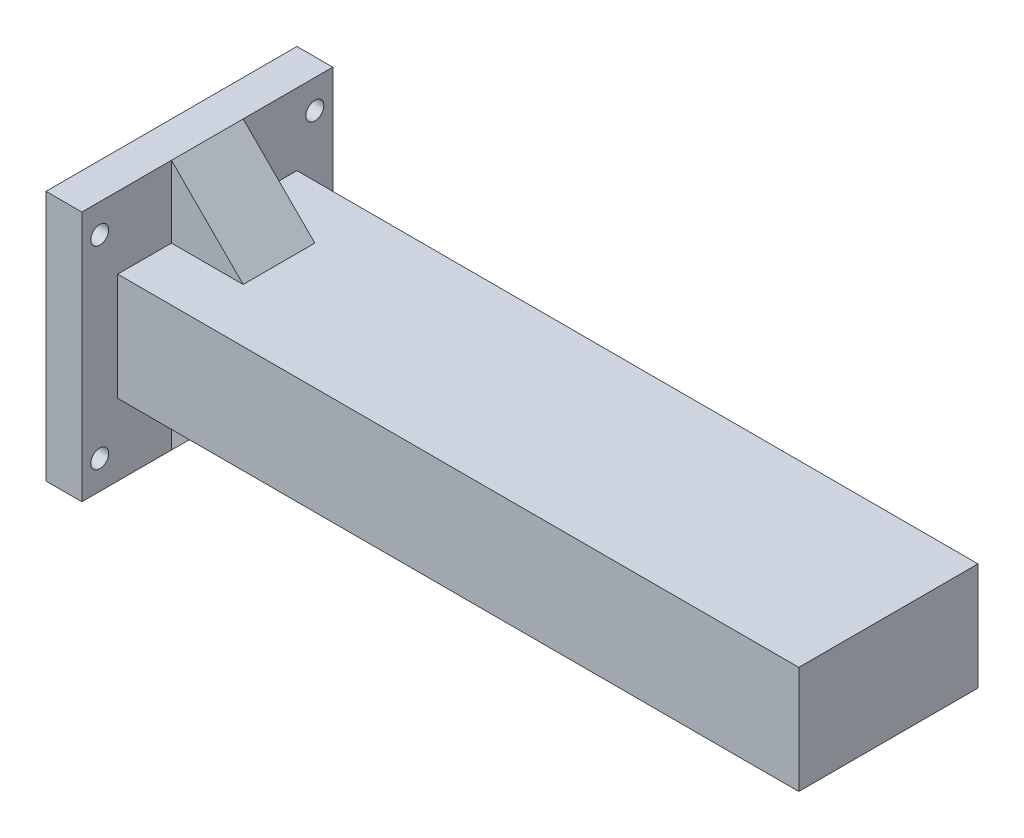
ISO-10303-21;
HEADER;
FILE_DESCRIPTION(('STEP AP214'),'2;1');
FILE_NAME('part.step','',(''),(''),'','','');
FILE_SCHEMA(('AUTOMOTIVE_DESIGN { 1 0 10303 214 1 1 1 1 }'));
ENDSEC;
DATA;
#1=APPLICATION_CONTEXT('core data for automotive mechanical design processes');
#2=APPLICATION_PROTOCOL_DEFINITION('international standard','automotive_design',2000,#1);
#3=PRODUCT_CONTEXT('',#1,'mechanical');
#4=PRODUCT('Part','Part','',(#3));
#5=PRODUCT_RELATED_PRODUCT_CATEGORY('part','',(#4));
#6=PRODUCT_DEFINITION_FORMATION('','',#4);
#7=PRODUCT_DEFINITION_CONTEXT('part definition',#1,'design');
#8=PRODUCT_DEFINITION('design','',#6,#7);
#9=PRODUCT_DEFINITION_SHAPE('','',#8);
#10=(LENGTH_UNIT() NAMED_UNIT(*) SI_UNIT(.MILLI.,.METRE.));
#11=(NAMED_UNIT(*) PLANE_ANGLE_UNIT() SI_UNIT($,.RADIAN.));
#12=(NAMED_UNIT(*) SI_UNIT($,.STERADIAN.) SOLID_ANGLE_UNIT());
#13=UNCERTAINTY_MEASURE_WITH_UNIT(LENGTH_MEASURE(1.E-05),#10,'distance_accuracy_value','');
#14=(GEOMETRIC_REPRESENTATION_CONTEXT(3) GLOBAL_UNCERTAINTY_ASSIGNED_CONTEXT((#13)) GLOBAL_UNIT_ASSIGNED_CONTEXT((#10,
#11,#12)) REPRESENTATION_CONTEXT('',''));
#15=CARTESIAN_POINT('',(0.,0.,0.));
#16=DIRECTION('',(0.,0.,1.));
#17=DIRECTION('',(1.,0.,0.));
#18=AXIS2_PLACEMENT_3D('',#15,#16,#17);
#19=CARTESIAN_POINT('',(-45.,17.5,12.5));
#20=DIRECTION('',(-1.,0.,0.));
#21=DIRECTION('',(0.,0.,1.));
#22=AXIS2_PLACEMENT_3D('',#19,#20,#21);
#23=PLANE('',#22);
#24=CARTESIAN_POINT('',(-45.,13.5,-15.));
#25=DIRECTION('',(-1.,0.,0.));
#26=DIRECTION('',(0.,0.,1.));
#27=AXIS2_PLACEMENT_3D('',#24,#25,#26);
#28=CIRCLE('',#27,1.24999999999998);
#29=CARTESIAN_POINT('',(-45.,13.5,-13.75));
#30=VERTEX_POINT('',#29);
#31=EDGE_CURVE('E196',#30,#30,#28,.T.);
#32=ORIENTED_EDGE('',*,*,#31,.T.);
#33=EDGE_LOOP('',(#32));
#34=FACE_BOUND('',#33,.T.);
#35=CARTESIAN_POINT('',(-45.,-13.5,-15.));
#36=DIRECTION('',(-1.,0.,0.));
#37=DIRECTION('',(0.,0.,1.));
#38=AXIS2_PLACEMENT_3D('',#35,#36,#37);
#39=CIRCLE('',#38,1.24999999999998);
#40=CARTESIAN_POINT('',(-45.,-13.5,-13.75));
#41=VERTEX_POINT('',#40);
#42=EDGE_CURVE('E211',#41,#41,#39,.T.);
#43=ORIENTED_EDGE('',*,*,#42,.T.);
#44=EDGE_LOOP('',(#43));
#45=FACE_BOUND('',#44,.T.);
#46=DIRECTION('',(0.,1.,0.));
#47=VECTOR('',#46,1.);
#48=CARTESIAN_POINT('',(-45.,17.5,-5.));
#49=LINE('',#48,#47);
#50=CARTESIAN_POINT('',(-45.,-17.5,-5.));
#51=VERTEX_POINT('',#50);
#52=CARTESIAN_POINT('',(-45.,-7.5,-5.));
#53=VERTEX_POINT('',#52);
#54=EDGE_CURVE('E141',#51,#53,#49,.T.);
#55=ORIENTED_EDGE('',*,*,#54,.F.);
#56=DIRECTION('',(0.,0.,-1.));
#57=VECTOR('',#56,1.);
#58=CARTESIAN_POINT('',(-45.,-17.5,12.5));
#59=LINE('',#58,#57);
#60=CARTESIAN_POINT('',(-45.,-17.5,-17.5));
#61=VERTEX_POINT('',#60);
#62=EDGE_CURVE('E285',#51,#61,#59,.T.);
#63=ORIENTED_EDGE('',*,*,#62,.T.);
#64=DIRECTION('',(0.,1.,0.));
#65=VECTOR('',#64,1.);
#66=CARTESIAN_POINT('',(-45.,17.5,-17.5));
#67=LINE('',#66,#65);
#68=CARTESIAN_POINT('',(-45.,17.5,-17.5));
#69=VERTEX_POINT('',#68);
#70=EDGE_CURVE('E238',#61,#69,#67,.T.);
#71=ORIENTED_EDGE('',*,*,#70,.T.);
#72=DIRECTION('',(0.,0.,-1.));
#73=VECTOR('',#72,1.);
#74=CARTESIAN_POINT('',(-45.,17.5,12.5));
#75=LINE('',#74,#73);
#76=CARTESIAN_POINT('',(-45.,17.5,-5.));
#77=VERTEX_POINT('',#76);
#78=EDGE_CURVE('E258',#77,#69,#75,.T.);
#79=ORIENTED_EDGE('',*,*,#78,.F.);
#80=DIRECTION('',(0.,1.,0.));
#81=VECTOR('',#80,1.);
#82=CARTESIAN_POINT('',(-45.,17.5,-5.));
#83=LINE('',#82,#81);
#84=CARTESIAN_POINT('',(-45.,7.5,-5.));
#85=VERTEX_POINT('',#84);
#86=EDGE_CURVE('E48',#85,#77,#83,.T.);
#87=ORIENTED_EDGE('',*,*,#86,.F.);
#88=DIRECTION('',(0.,0.,-1.));
#89=VECTOR('',#88,1.);
#90=CARTESIAN_POINT('',(-45.,7.5,12.5));
#91=LINE('',#90,#89);
#92=CARTESIAN_POINT('',(-45.,7.5,-12.5));
#93=VERTEX_POINT('',#92);
#94=EDGE_CURVE('E271',#85,#93,#91,.T.);
#95=ORIENTED_EDGE('',*,*,#94,.T.);
#96=DIRECTION('',(0.,-1.,0.));
#97=VECTOR('',#96,1.);
#98=CARTESIAN_POINT('',(-45.,0.,-12.5));
#99=LINE('',#98,#97);
#100=CARTESIAN_POINT('',(-45.,-7.5,-12.5));
#101=VERTEX_POINT('',#100);
#102=EDGE_CURVE('E144',#93,#101,#99,.T.);
#103=ORIENTED_EDGE('',*,*,#102,.T.);
#104=DIRECTION('',(0.,0.,-1.));
#105=VECTOR('',#104,1.);
#106=CARTESIAN_POINT('',(-45.,-7.5,12.5));
#107=LINE('',#106,#105);
#108=EDGE_CURVE('E139',#53,#101,#107,.T.);
#109=ORIENTED_EDGE('',*,*,#108,.F.);
#110=EDGE_LOOP('',(#55,#63,#71,#79,#87,#95,#103,#109));
#111=FACE_BOUND('',#110,.T.);
#112=ADVANCED_FACE('F39',(#34,#45,#111),#23,.F.);
#113=CARTESIAN_POINT('',(0.,0.,12.5));
#114=DIRECTION('',(0.,0.,1.));
#115=DIRECTION('',(1.,0.,0.));
#116=AXIS2_PLACEMENT_3D('',#113,#114,#115);
#117=PLANE('',#116);
#118=DIRECTION('',(-1.,0.,0.));
#119=VECTOR('',#118,1.);
#120=CARTESIAN_POINT('',(-45.,7.5,12.5));
#121=LINE('',#120,#119);
#122=CARTESIAN_POINT('',(50.,7.5,12.5));
#123=VERTEX_POINT('',#122);
#124=CARTESIAN_POINT('',(-45.,7.5,12.5));
#125=VERTEX_POINT('',#124);
#126=EDGE_CURVE('E255',#123,#125,#121,.T.);
#127=ORIENTED_EDGE('',*,*,#126,.T.);
#128=DIRECTION('',(0.,-1.,0.));
#129=VECTOR('',#128,1.);
#130=CARTESIAN_POINT('',(-45.,0.,12.5));
#131=LINE('',#130,#129);
#132=CARTESIAN_POINT('',(-45.,-7.5,12.5));
#133=VERTEX_POINT('',#132);
#134=EDGE_CURVE('E229',#125,#133,#131,.T.);
#135=ORIENTED_EDGE('',*,*,#134,.T.);
#136=DIRECTION('',(1.,0.,0.));
#137=VECTOR('',#136,1.);
#138=CARTESIAN_POINT('',(50.,-7.5,12.5));
#139=LINE('',#138,#137);
#140=CARTESIAN_POINT('',(50.,-7.5,12.5));
#141=VERTEX_POINT('',#140);
#142=EDGE_CURVE('E248',#133,#141,#139,.T.);
#143=ORIENTED_EDGE('',*,*,#142,.T.);
#144=DIRECTION('',(0.,1.,0.));
#145=VECTOR('',#144,1.);
#146=CARTESIAN_POINT('',(50.,-7.5,12.5));
#147=LINE('',#146,#145);
#148=EDGE_CURVE('E251',#141,#123,#147,.T.);
#149=ORIENTED_EDGE('',*,*,#148,.T.);
#150=EDGE_LOOP('',(#127,#135,#143,#149));
#151=FACE_BOUND('',#150,.T.);
#152=ADVANCED_FACE('F376',(#151),#117,.T.);
#153=CARTESIAN_POINT('',(0.,0.,-12.5));
#154=DIRECTION('',(0.,0.,1.));
#155=DIRECTION('',(1.,0.,0.));
#156=AXIS2_PLACEMENT_3D('',#153,#154,#155);
#157=PLANE('',#156);
#158=ORIENTED_EDGE('',*,*,#102,.F.);
#159=DIRECTION('',(-1.,0.,0.));
#160=VECTOR('',#159,1.);
#161=CARTESIAN_POINT('',(-45.,7.5,-12.5));
#162=LINE('',#161,#160);
#163=CARTESIAN_POINT('',(50.,7.5,-12.5));
#164=VERTEX_POINT('',#163);
#165=EDGE_CURVE('E252',#164,#93,#162,.T.);
#166=ORIENTED_EDGE('',*,*,#165,.F.);
#167=DIRECTION('',(0.,1.,0.));
#168=VECTOR('',#167,1.);
#169=CARTESIAN_POINT('',(50.,-7.5,-12.5));
#170=LINE('',#169,#168);
#171=CARTESIAN_POINT('',(50.,-7.5,-12.5));
#172=VERTEX_POINT('',#171);
#173=EDGE_CURVE('E261',#172,#164,#170,.T.);
#174=ORIENTED_EDGE('',*,*,#173,.F.);
#175=DIRECTION('',(1.,0.,0.));
#176=VECTOR('',#175,1.);
#177=CARTESIAN_POINT('',(50.,-7.5,-12.5));
#178=LINE('',#177,#176);
#179=EDGE_CURVE('E247',#101,#172,#178,.T.);
#180=ORIENTED_EDGE('',*,*,#179,.F.);
#181=EDGE_LOOP('',(#158,#166,#174,#180));
#182=FACE_BOUND('',#181,.T.);
#183=ADVANCED_FACE('F366',(#182),#157,.F.);
#184=CARTESIAN_POINT('',(-45.,17.5,12.5));
#185=DIRECTION('',(0.,-1.,0.));
#186=DIRECTION('',(0.,0.,-1.));
#187=AXIS2_PLACEMENT_3D('',#184,#185,#186);
#188=PLANE('',#187);
#189=CARTESIAN_POINT('',(-45.,17.5,17.5));
#190=VERTEX_POINT('',#189);
#191=CARTESIAN_POINT('',(-45.,17.5,5.));
#192=VERTEX_POINT('',#191);
#193=EDGE_CURVE('E267',#190,#192,#75,.T.);
#194=ORIENTED_EDGE('',*,*,#193,.T.);
#195=EDGE_CURVE('E272',#192,#77,#75,.T.);
#196=ORIENTED_EDGE('',*,*,#195,.T.);
#197=ORIENTED_EDGE('',*,*,#78,.T.);
#198=DIRECTION('',(-1.,0.,0.));
#199=VECTOR('',#198,1.);
#200=CARTESIAN_POINT('',(-50.,17.5,-17.5));
#201=LINE('',#200,#199);
#202=CARTESIAN_POINT('',(-50.,17.5,-17.5));
#203=VERTEX_POINT('',#202);
#204=EDGE_CURVE('E217',#69,#203,#201,.T.);
#205=ORIENTED_EDGE('',*,*,#204,.T.);
#206=DIRECTION('',(0.,0.,-1.));
#207=VECTOR('',#206,1.);
#208=CARTESIAN_POINT('',(-50.,17.5,12.5));
#209=LINE('',#208,#207);
#210=CARTESIAN_POINT('',(-50.,17.5,17.5));
#211=VERTEX_POINT('',#210);
#212=EDGE_CURVE('E294',#211,#203,#209,.T.);
#213=ORIENTED_EDGE('',*,*,#212,.F.);
#214=DIRECTION('',(-1.,0.,0.));
#215=VECTOR('',#214,1.);
#216=CARTESIAN_POINT('',(-50.,17.5,17.5));
#217=LINE('',#216,#215);
#218=EDGE_CURVE('E225',#190,#211,#217,.T.);
#219=ORIENTED_EDGE('',*,*,#218,.F.);
#220=EDGE_LOOP('',(#194,#196,#197,#205,#213,#219));
#221=FACE_BOUND('',#220,.T.);
#222=ADVANCED_FACE('F41',(#221),#188,.F.);
#223=CARTESIAN_POINT('',(-50.,17.5,12.5));
#224=DIRECTION('',(1.,0.,0.));
#225=DIRECTION('',(0.,0.,-1.));
#226=AXIS2_PLACEMENT_3D('',#223,#224,#225);
#227=PLANE('',#226);
#228=CARTESIAN_POINT('',(-50.,13.5,15.));
#229=DIRECTION('',(-1.,0.,0.));
#230=DIRECTION('',(0.,0.,1.));
#231=AXIS2_PLACEMENT_3D('',#228,#229,#230);
#232=CIRCLE('',#231,1.24999999999999);
#233=CARTESIAN_POINT('',(-50.,13.5,16.25));
#234=VERTEX_POINT('',#233);
#235=EDGE_CURVE('E197',#234,#234,#232,.T.);
#236=ORIENTED_EDGE('',*,*,#235,.F.);
#237=EDGE_LOOP('',(#236));
#238=FACE_BOUND('',#237,.T.);
#239=CARTESIAN_POINT('',(-50.,-13.5,15.));
#240=DIRECTION('',(-1.,0.,0.));
#241=DIRECTION('',(0.,0.,1.));
#242=AXIS2_PLACEMENT_3D('',#239,#240,#241);
#243=CIRCLE('',#242,1.24999999999999);
#244=CARTESIAN_POINT('',(-50.,-13.5,16.25));
#245=VERTEX_POINT('',#244);
#246=EDGE_CURVE('E202',#245,#245,#243,.T.);
#247=ORIENTED_EDGE('',*,*,#246,.F.);
#248=EDGE_LOOP('',(#247));
#249=FACE_BOUND('',#248,.T.);
#250=ORIENTED_EDGE('',*,*,#212,.T.);
#251=DIRECTION('',(0.,-1.,0.));
#252=VECTOR('',#251,1.);
#253=CARTESIAN_POINT('',(-50.,17.5,-17.5));
#254=LINE('',#253,#252);
#255=CARTESIAN_POINT('',(-50.,-17.5,-17.5));
#256=VERTEX_POINT('',#255);
#257=EDGE_CURVE('E230',#203,#256,#254,.T.);
#258=ORIENTED_EDGE('',*,*,#257,.T.);
#259=DIRECTION('',(0.,0.,-1.));
#260=VECTOR('',#259,1.);
#261=CARTESIAN_POINT('',(-50.,-17.5,12.5));
#262=LINE('',#261,#260);
#263=CARTESIAN_POINT('',(-50.,-17.5,17.5));
#264=VERTEX_POINT('',#263);
#265=EDGE_CURVE('E290',#264,#256,#262,.T.);
#266=ORIENTED_EDGE('',*,*,#265,.F.);
#267=DIRECTION('',(0.,-1.,0.));
#268=VECTOR('',#267,1.);
#269=CARTESIAN_POINT('',(-50.,17.5,17.5));
#270=LINE('',#269,#268);
#271=EDGE_CURVE('E212',#211,#264,#270,.T.);
#272=ORIENTED_EDGE('',*,*,#271,.F.);
#273=EDGE_LOOP('',(#250,#258,#266,#272));
#274=FACE_BOUND('',#273,.T.);
#275=CARTESIAN_POINT('',(-50.,13.5,-15.));
#276=DIRECTION('',(-1.,0.,0.));
#277=DIRECTION('',(0.,0.,1.));
#278=AXIS2_PLACEMENT_3D('',#275,#276,#277);
#279=CIRCLE('',#278,1.24999999999999);
#280=CARTESIAN_POINT('',(-50.,13.5,-13.75));
#281=VERTEX_POINT('',#280);
#282=EDGE_CURVE('E192',#281,#281,#279,.T.);
#283=ORIENTED_EDGE('',*,*,#282,.F.);
#284=EDGE_LOOP('',(#283));
#285=FACE_BOUND('',#284,.T.);
#286=CARTESIAN_POINT('',(-50.,-13.5,-15.));
#287=DIRECTION('',(-1.,0.,0.));
#288=DIRECTION('',(0.,0.,1.));
#289=AXIS2_PLACEMENT_3D('',#286,#287,#288);
#290=CIRCLE('',#289,1.24999999999999);
#291=CARTESIAN_POINT('',(-50.,-13.5,-13.75));
#292=VERTEX_POINT('',#291);
#293=EDGE_CURVE('E207',#292,#292,#290,.T.);
#294=ORIENTED_EDGE('',*,*,#293,.F.);
#295=EDGE_LOOP('',(#294));
#296=FACE_BOUND('',#295,.T.);
#297=ADVANCED_FACE('F339',(#238,#249,#274,#285,#296),#227,.F.);
#298=CARTESIAN_POINT('',(-50.,-17.5,12.5));
#299=DIRECTION('',(0.,1.,0.));
#300=DIRECTION('',(0.,0.,1.));
#301=AXIS2_PLACEMENT_3D('',#298,#299,#300);
#302=PLANE('',#301);
#303=ORIENTED_EDGE('',*,*,#265,.T.);
#304=DIRECTION('',(1.,0.,0.));
#305=VECTOR('',#304,1.);
#306=CARTESIAN_POINT('',(-50.,-17.5,-17.5));
#307=LINE('',#306,#305);
#308=EDGE_CURVE('E234',#256,#61,#307,.T.);
#309=ORIENTED_EDGE('',*,*,#308,.T.);
#310=ORIENTED_EDGE('',*,*,#62,.F.);
#311=CARTESIAN_POINT('',(-45.,-17.5,5.));
#312=VERTEX_POINT('',#311);
#313=EDGE_CURVE('E291',#312,#51,#59,.T.);
#314=ORIENTED_EDGE('',*,*,#313,.F.);
#315=CARTESIAN_POINT('',(-45.,-17.5,17.5));
#316=VERTEX_POINT('',#315);
#317=EDGE_CURVE('E286',#316,#312,#59,.T.);
#318=ORIENTED_EDGE('',*,*,#317,.F.);
#319=DIRECTION('',(1.,0.,0.));
#320=VECTOR('',#319,1.);
#321=CARTESIAN_POINT('',(-50.,-17.5,17.5));
#322=LINE('',#321,#320);
#323=EDGE_CURVE('E216',#264,#316,#322,.T.);
#324=ORIENTED_EDGE('',*,*,#323,.F.);
#325=EDGE_LOOP('',(#303,#309,#310,#314,#318,#324));
#326=FACE_BOUND('',#325,.T.);
#327=ADVANCED_FACE('F345',(#326),#302,.F.);
#328=CARTESIAN_POINT('',(50.,-7.5,12.5));
#329=DIRECTION('',(0.,1.,0.));
#330=DIRECTION('',(0.,0.,1.));
#331=AXIS2_PLACEMENT_3D('',#328,#329,#330);
#332=PLANE('',#331);
#333=CARTESIAN_POINT('',(-45.,-7.5,5.));
#334=VERTEX_POINT('',#333);
#335=EDGE_CURVE('E147',#133,#334,#107,.T.);
#336=ORIENTED_EDGE('',*,*,#335,.T.);
#337=DIRECTION('',(1.,0.,0.));
#338=VECTOR('',#337,1.);
#339=CARTESIAN_POINT('',(50.,-7.5,5.));
#340=LINE('',#339,#338);
#341=CARTESIAN_POINT('',(-35.,-7.5,5.));
#342=VERTEX_POINT('',#341);
#343=EDGE_CURVE('E55',#334,#342,#340,.T.);
#344=ORIENTED_EDGE('',*,*,#343,.T.);
#345=DIRECTION('',(0.,0.,-1.));
#346=VECTOR('',#345,1.);
#347=CARTESIAN_POINT('',(-35.,-7.5,12.5));
#348=LINE('',#347,#346);
#349=CARTESIAN_POINT('',(-35.,-7.5,-5.));
#350=VERTEX_POINT('',#349);
#351=EDGE_CURVE('E59',#342,#350,#348,.T.);
#352=ORIENTED_EDGE('',*,*,#351,.T.);
#353=DIRECTION('',(1.,0.,0.));
#354=VECTOR('',#353,1.);
#355=CARTESIAN_POINT('',(50.,-7.5,-5.));
#356=LINE('',#355,#354);
#357=EDGE_CURVE('E150',#53,#350,#356,.T.);
#358=ORIENTED_EDGE('',*,*,#357,.F.);
#359=ORIENTED_EDGE('',*,*,#108,.T.);
#360=ORIENTED_EDGE('',*,*,#179,.T.);
#361=DIRECTION('',(0.,0.,-1.));
#362=VECTOR('',#361,1.);
#363=CARTESIAN_POINT('',(50.,-7.5,12.5));
#364=LINE('',#363,#362);
#365=EDGE_CURVE('E148',#141,#172,#364,.T.);
#366=ORIENTED_EDGE('',*,*,#365,.F.);
#367=ORIENTED_EDGE('',*,*,#142,.F.);
#368=EDGE_LOOP('',(#336,#344,#352,#358,#359,#360,#366,#367));
#369=FACE_BOUND('',#368,.T.);
#370=ADVANCED_FACE('F151',(#369),#332,.F.);
#371=CARTESIAN_POINT('',(50.,-7.5,12.5));
#372=DIRECTION('',(-1.,0.,0.));
#373=DIRECTION('',(0.,0.,1.));
#374=AXIS2_PLACEMENT_3D('',#371,#372,#373);
#375=PLANE('',#374);
#376=ORIENTED_EDGE('',*,*,#173,.T.);
#377=DIRECTION('',(0.,0.,-1.));
#378=VECTOR('',#377,1.);
#379=CARTESIAN_POINT('',(50.,7.5,12.5));
#380=LINE('',#379,#378);
#381=EDGE_CURVE('E277',#123,#164,#380,.T.);
#382=ORIENTED_EDGE('',*,*,#381,.F.);
#383=ORIENTED_EDGE('',*,*,#148,.F.);
#384=ORIENTED_EDGE('',*,*,#365,.T.);
#385=EDGE_LOOP('',(#376,#382,#383,#384));
#386=FACE_BOUND('',#385,.T.);
#387=ADVANCED_FACE('F372',(#386),#375,.F.);
#388=CARTESIAN_POINT('',(-45.,7.5,12.5));
#389=DIRECTION('',(0.,-1.,0.));
#390=DIRECTION('',(0.,0.,-1.));
#391=AXIS2_PLACEMENT_3D('',#388,#389,#390);
#392=PLANE('',#391);
#393=DIRECTION('',(0.,0.,-1.));
#394=VECTOR('',#393,1.);
#395=CARTESIAN_POINT('',(-34.9999999999999,7.5,12.5));
#396=LINE('',#395,#394);
#397=CARTESIAN_POINT('',(-34.9999999999999,7.5,-5.));
#398=VERTEX_POINT('',#397);
#399=CARTESIAN_POINT('',(-34.9999999999999,7.5,5.));
#400=VERTEX_POINT('',#399);
#401=EDGE_CURVE('E189',#398,#400,#396,.F.);
#402=ORIENTED_EDGE('',*,*,#401,.T.);
#403=DIRECTION('',(-1.,0.,0.));
#404=VECTOR('',#403,1.);
#405=CARTESIAN_POINT('',(-45.,7.5,5.));
#406=LINE('',#405,#404);
#407=CARTESIAN_POINT('',(-45.,7.5,5.));
#408=VERTEX_POINT('',#407);
#409=EDGE_CURVE('E186',#400,#408,#406,.T.);
#410=ORIENTED_EDGE('',*,*,#409,.T.);
#411=EDGE_CURVE('E273',#125,#408,#91,.T.);
#412=ORIENTED_EDGE('',*,*,#411,.F.);
#413=ORIENTED_EDGE('',*,*,#126,.F.);
#414=ORIENTED_EDGE('',*,*,#381,.T.);
#415=ORIENTED_EDGE('',*,*,#165,.T.);
#416=ORIENTED_EDGE('',*,*,#94,.F.);
#417=DIRECTION('',(-1.,0.,0.));
#418=VECTOR('',#417,1.);
#419=CARTESIAN_POINT('',(-45.,7.5,-5.));
#420=LINE('',#419,#418);
#421=EDGE_CURVE('E179',#398,#85,#420,.T.);
#422=ORIENTED_EDGE('',*,*,#421,.F.);
#423=EDGE_LOOP('',(#402,#410,#412,#413,#414,#415,#416,#422));
#424=FACE_BOUND('',#423,.T.);
#425=ADVANCED_FACE('F324',(#424),#392,.F.);
#426=CARTESIAN_POINT('',(-45.,13.5,15.));
#427=DIRECTION('',(-1.,0.,0.));
#428=DIRECTION('',(0.,0.,1.));
#429=AXIS2_PLACEMENT_3D('',#426,#427,#428);
#430=CIRCLE('',#429,1.24999999999998);
#431=CARTESIAN_POINT('',(-45.,13.5,16.25));
#432=VERTEX_POINT('',#431);
#433=EDGE_CURVE('E201',#432,#432,#430,.T.);
#434=ORIENTED_EDGE('',*,*,#433,.T.);
#435=EDGE_LOOP('',(#434));
#436=FACE_BOUND('',#435,.T.);
#437=CARTESIAN_POINT('',(-45.,-13.5,15.));
#438=DIRECTION('',(-1.,0.,0.));
#439=DIRECTION('',(0.,0.,1.));
#440=AXIS2_PLACEMENT_3D('',#437,#438,#439);
#441=CIRCLE('',#440,1.24999999999998);
#442=CARTESIAN_POINT('',(-45.,-13.5,16.25));
#443=VERTEX_POINT('',#442);
#444=EDGE_CURVE('E206',#443,#443,#441,.T.);
#445=ORIENTED_EDGE('',*,*,#444,.T.);
#446=EDGE_LOOP('',(#445));
#447=FACE_BOUND('',#446,.T.);
#448=ORIENTED_EDGE('',*,*,#317,.T.);
#449=DIRECTION('',(0.,1.,0.));
#450=VECTOR('',#449,1.);
#451=CARTESIAN_POINT('',(-45.,17.5,5.));
#452=LINE('',#451,#450);
#453=EDGE_CURVE('E156',#312,#334,#452,.T.);
#454=ORIENTED_EDGE('',*,*,#453,.T.);
#455=ORIENTED_EDGE('',*,*,#335,.F.);
#456=ORIENTED_EDGE('',*,*,#134,.F.);
#457=ORIENTED_EDGE('',*,*,#411,.T.);
#458=DIRECTION('',(0.,1.,0.));
#459=VECTOR('',#458,1.);
#460=CARTESIAN_POINT('',(-45.,17.5,5.));
#461=LINE('',#460,#459);
#462=EDGE_CURVE('E11',#408,#192,#461,.T.);
#463=ORIENTED_EDGE('',*,*,#462,.T.);
#464=ORIENTED_EDGE('',*,*,#193,.F.);
#465=DIRECTION('',(0.,1.,0.));
#466=VECTOR('',#465,1.);
#467=CARTESIAN_POINT('',(-45.,17.5,17.5));
#468=LINE('',#467,#466);
#469=EDGE_CURVE('E221',#316,#190,#468,.T.);
#470=ORIENTED_EDGE('',*,*,#469,.F.);
#471=EDGE_LOOP('',(#448,#454,#455,#456,#457,#463,#464,#470));
#472=FACE_BOUND('',#471,.T.);
#473=ADVANCED_FACE('F330',(#436,#447,#472),#23,.F.);
#474=CARTESIAN_POINT('',(0.,0.,-17.5));
#475=DIRECTION('',(0.,0.,1.));
#476=DIRECTION('',(1.,0.,0.));
#477=AXIS2_PLACEMENT_3D('',#474,#475,#476);
#478=PLANE('',#477);
#479=ORIENTED_EDGE('',*,*,#257,.F.);
#480=ORIENTED_EDGE('',*,*,#204,.F.);
#481=ORIENTED_EDGE('',*,*,#70,.F.);
#482=ORIENTED_EDGE('',*,*,#308,.F.);
#483=EDGE_LOOP('',(#479,#480,#481,#482));
#484=FACE_BOUND('',#483,.T.);
#485=ADVANCED_FACE('F360',(#484),#478,.F.);
#486=CARTESIAN_POINT('',(0.,0.,17.5));
#487=DIRECTION('',(0.,0.,1.));
#488=DIRECTION('',(1.,0.,0.));
#489=AXIS2_PLACEMENT_3D('',#486,#487,#488);
#490=PLANE('',#489);
#491=ORIENTED_EDGE('',*,*,#271,.T.);
#492=ORIENTED_EDGE('',*,*,#323,.T.);
#493=ORIENTED_EDGE('',*,*,#469,.T.);
#494=ORIENTED_EDGE('',*,*,#218,.T.);
#495=EDGE_LOOP('',(#491,#492,#493,#494));
#496=FACE_BOUND('',#495,.T.);
#497=ADVANCED_FACE('F337',(#496),#490,.T.);
#498=CARTESIAN_POINT('',(-50.,-13.5,-15.));
#499=DIRECTION('',(-1.,0.,0.));
#500=DIRECTION('',(0.,0.,1.));
#501=AXIS2_PLACEMENT_3D('',#498,#499,#500);
#502=CYLINDRICAL_SURFACE('',#501,1.24999999999998);
#503=ORIENTED_EDGE('',*,*,#293,.T.);
#504=EDGE_LOOP('',(#503));
#505=FACE_BOUND('',#504,.T.);
#506=ORIENTED_EDGE('',*,*,#42,.F.);
#507=EDGE_LOOP('',(#506));
#508=FACE_BOUND('',#507,.T.);
#509=ADVANCED_FACE('F411',(#505,#508),#502,.F.);
#510=CARTESIAN_POINT('',(-50.,-13.5,15.));
#511=DIRECTION('',(-1.,0.,0.));
#512=DIRECTION('',(0.,0.,1.));
#513=AXIS2_PLACEMENT_3D('',#510,#511,#512);
#514=CYLINDRICAL_SURFACE('',#513,1.24999999999998);
#515=ORIENTED_EDGE('',*,*,#246,.T.);
#516=EDGE_LOOP('',(#515));
#517=FACE_BOUND('',#516,.T.);
#518=ORIENTED_EDGE('',*,*,#444,.F.);
#519=EDGE_LOOP('',(#518));
#520=FACE_BOUND('',#519,.T.);
#521=ADVANCED_FACE('F407',(#517,#520),#514,.F.);
#522=CARTESIAN_POINT('',(-50.,13.5,15.));
#523=DIRECTION('',(-1.,0.,0.));
#524=DIRECTION('',(0.,0.,1.));
#525=AXIS2_PLACEMENT_3D('',#522,#523,#524);
#526=CYLINDRICAL_SURFACE('',#525,1.24999999999998);
#527=ORIENTED_EDGE('',*,*,#235,.T.);
#528=EDGE_LOOP('',(#527));
#529=FACE_BOUND('',#528,.T.);
#530=ORIENTED_EDGE('',*,*,#433,.F.);
#531=EDGE_LOOP('',(#530));
#532=FACE_BOUND('',#531,.T.);
#533=ADVANCED_FACE('F410',(#529,#532),#526,.F.);
#534=CARTESIAN_POINT('',(-50.,13.5,-15.));
#535=DIRECTION('',(-1.,0.,0.));
#536=DIRECTION('',(0.,0.,1.));
#537=AXIS2_PLACEMENT_3D('',#534,#535,#536);
#538=CYLINDRICAL_SURFACE('',#537,1.24999999999998);
#539=ORIENTED_EDGE('',*,*,#282,.T.);
#540=EDGE_LOOP('',(#539));
#541=FACE_BOUND('',#540,.T.);
#542=ORIENTED_EDGE('',*,*,#31,.F.);
#543=EDGE_LOOP('',(#542));
#544=FACE_BOUND('',#543,.T.);
#545=ADVANCED_FACE('F419',(#541,#544),#538,.F.);
#546=CARTESIAN_POINT('',(-45.,17.5,0.));
#547=DIRECTION('',(-0.707106781186544,-0.707106781186551,0.));
#548=DIRECTION('',(0.707106781186551,-0.707106781186544,0.));
#549=AXIS2_PLACEMENT_3D('',#546,#547,#548);
#550=PLANE('',#549);
#551=ORIENTED_EDGE('',*,*,#401,.F.);
#552=DIRECTION('',(0.707106781186551,-0.707106781186544,0.));
#553=VECTOR('',#552,1.);
#554=CARTESIAN_POINT('',(-45.,17.5,-5.));
#555=LINE('',#554,#553);
#556=EDGE_CURVE('E174',#77,#398,#555,.T.);
#557=ORIENTED_EDGE('',*,*,#556,.F.);
#558=ORIENTED_EDGE('',*,*,#195,.F.);
#559=DIRECTION('',(0.707106781186551,-0.707106781186544,0.));
#560=VECTOR('',#559,1.);
#561=CARTESIAN_POINT('',(-45.,17.5,5.));
#562=LINE('',#561,#560);
#563=EDGE_CURVE('E175',#192,#400,#562,.T.);
#564=ORIENTED_EDGE('',*,*,#563,.T.);
#565=EDGE_LOOP('',(#551,#557,#558,#564));
#566=FACE_BOUND('',#565,.T.);
#567=ADVANCED_FACE('F320',(#566),#550,.F.);
#568=CARTESIAN_POINT('',(0.,0.,5.));
#569=DIRECTION('',(0.,0.,1.));
#570=DIRECTION('',(1.,0.,0.));
#571=AXIS2_PLACEMENT_3D('',#568,#569,#570);
#572=PLANE('',#571);
#573=ORIENTED_EDGE('',*,*,#409,.F.);
#574=ORIENTED_EDGE('',*,*,#563,.F.);
#575=ORIENTED_EDGE('',*,*,#462,.F.);
#576=EDGE_LOOP('',(#573,#574,#575));
#577=FACE_BOUND('',#576,.T.);
#578=ADVANCED_FACE('F328',(#577),#572,.T.);
#579=CARTESIAN_POINT('',(0.,0.,-5.));
#580=DIRECTION('',(0.,0.,1.));
#581=DIRECTION('',(1.,0.,0.));
#582=AXIS2_PLACEMENT_3D('',#579,#580,#581);
#583=PLANE('',#582);
#584=ORIENTED_EDGE('',*,*,#556,.T.);
#585=ORIENTED_EDGE('',*,*,#421,.T.);
#586=ORIENTED_EDGE('',*,*,#86,.T.);
#587=EDGE_LOOP('',(#584,#585,#586));
#588=FACE_BOUND('',#587,.T.);
#589=ADVANCED_FACE('F314',(#588),#583,.F.);
#590=CARTESIAN_POINT('',(-45.,-17.5,0.));
#591=DIRECTION('',(0.707106781186549,-0.707106781186546,0.));
#592=DIRECTION('',(0.707106781186546,0.707106781186549,0.));
#593=AXIS2_PLACEMENT_3D('',#590,#591,#592);
#594=PLANE('',#593);
#595=ORIENTED_EDGE('',*,*,#351,.F.);
#596=DIRECTION('',(0.707106781186546,0.707106781186549,0.));
#597=VECTOR('',#596,1.);
#598=CARTESIAN_POINT('',(-45.,-17.5,5.));
#599=LINE('',#598,#597);
#600=EDGE_CURVE('E161',#312,#342,#599,.T.);
#601=ORIENTED_EDGE('',*,*,#600,.F.);
#602=ORIENTED_EDGE('',*,*,#313,.T.);
#603=DIRECTION('',(0.707106781186546,0.707106781186549,0.));
#604=VECTOR('',#603,1.);
#605=CARTESIAN_POINT('',(-45.,-17.5,-5.));
#606=LINE('',#605,#604);
#607=EDGE_CURVE('E159',#51,#350,#606,.T.);
#608=ORIENTED_EDGE('',*,*,#607,.T.);
#609=EDGE_LOOP('',(#595,#601,#602,#608));
#610=FACE_BOUND('',#609,.T.);
#611=ADVANCED_FACE('F353',(#610),#594,.T.);
#612=CARTESIAN_POINT('',(0.,0.,5.));
#613=DIRECTION('',(0.,0.,1.));
#614=DIRECTION('',(1.,0.,0.));
#615=AXIS2_PLACEMENT_3D('',#612,#613,#614);
#616=PLANE('',#615);
#617=ORIENTED_EDGE('',*,*,#343,.F.);
#618=ORIENTED_EDGE('',*,*,#453,.F.);
#619=ORIENTED_EDGE('',*,*,#600,.T.);
#620=EDGE_LOOP('',(#617,#618,#619));
#621=FACE_BOUND('',#620,.T.);
#622=ADVANCED_FACE('F350',(#621),#616,.T.);
#623=CARTESIAN_POINT('',(0.,0.,-5.));
#624=DIRECTION('',(0.,0.,1.));
#625=DIRECTION('',(1.,0.,0.));
#626=AXIS2_PLACEMENT_3D('',#623,#624,#625);
#627=PLANE('',#626);
#628=ORIENTED_EDGE('',*,*,#54,.T.);
#629=ORIENTED_EDGE('',*,*,#357,.T.);
#630=ORIENTED_EDGE('',*,*,#607,.F.);
#631=EDGE_LOOP('',(#628,#629,#630));
#632=FACE_BOUND('',#631,.T.);
#633=ADVANCED_FACE('F158',(#632),#627,.F.);
#634=CLOSED_SHELL('',(#112,#152,#183,#222,#297,#327,#370,#387,#425,#473,#485,#497,#509,#521,
#533,#545,#567,#578,#589,#611,#622,#633));
#635=MANIFOLD_SOLID_BREP('B2',#634);
#636=ADVANCED_BREP_SHAPE_REPRESENTATION('',(#18,#635),#14);
#637=SHAPE_DEFINITION_REPRESENTATION(#9,#636);
ENDSEC;
END-ISO-10303-21;
